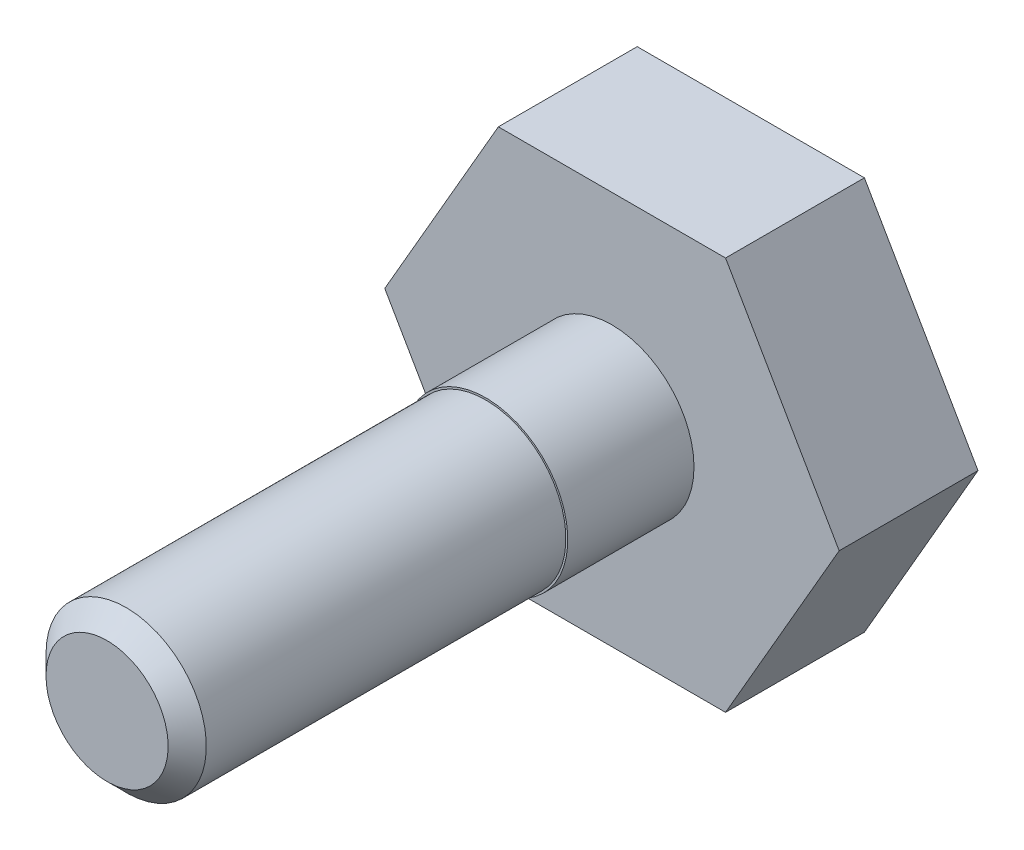
ISO-10303-21;
HEADER;
FILE_DESCRIPTION(('STEP AP214'),'2;1');
FILE_NAME('part.step','',(''),(''),'','','');
FILE_SCHEMA(('AUTOMOTIVE_DESIGN { 1 0 10303 214 1 1 1 1 }'));
ENDSEC;
DATA;
#1=APPLICATION_CONTEXT('core data for automotive mechanical design processes');
#2=APPLICATION_PROTOCOL_DEFINITION('international standard','automotive_design',2000,#1);
#3=PRODUCT_CONTEXT('',#1,'mechanical');
#4=PRODUCT('Part','Part','',(#3));
#5=PRODUCT_RELATED_PRODUCT_CATEGORY('part','',(#4));
#6=PRODUCT_DEFINITION_FORMATION('','',#4);
#7=PRODUCT_DEFINITION_CONTEXT('part definition',#1,'design');
#8=PRODUCT_DEFINITION('design','',#6,#7);
#9=PRODUCT_DEFINITION_SHAPE('','',#8);
#10=(LENGTH_UNIT() NAMED_UNIT(*) SI_UNIT(.MILLI.,.METRE.));
#11=(NAMED_UNIT(*) PLANE_ANGLE_UNIT() SI_UNIT($,.RADIAN.));
#12=(NAMED_UNIT(*) SI_UNIT($,.STERADIAN.) SOLID_ANGLE_UNIT());
#13=UNCERTAINTY_MEASURE_WITH_UNIT(LENGTH_MEASURE(1.E-05),#10,'distance_accuracy_value','');
#14=(GEOMETRIC_REPRESENTATION_CONTEXT(3) GLOBAL_UNCERTAINTY_ASSIGNED_CONTEXT((#13)) GLOBAL_UNIT_ASSIGNED_CONTEXT((#10,
#11,#12)) REPRESENTATION_CONTEXT('',''));
#15=CARTESIAN_POINT('',(0.,0.,0.));
#16=DIRECTION('',(0.,0.,1.));
#17=DIRECTION('',(1.,0.,0.));
#18=AXIS2_PLACEMENT_3D('',#15,#16,#17);
#19=CARTESIAN_POINT('',(-4.50000000000009,7.79422863405989,2.75));
#20=DIRECTION('',(0.866025403784441,-0.499999999999995,0.));
#21=DIRECTION('',(0.499999999999995,0.866025403784441,0.));
#22=AXIS2_PLACEMENT_3D('',#19,#20,#21);
#23=PLANE('',#22);
#24=DIRECTION('',(-0.499999999999995,-0.866025403784441,0.));
#25=VECTOR('',#24,1.);
#26=CARTESIAN_POINT('',(-4.50000000000009,7.79422863405989,-2.75));
#27=LINE('',#26,#25);
#28=CARTESIAN_POINT('',(-4.50000000000009,7.79422863405989,-2.75));
#29=VERTEX_POINT('',#28);
#30=CARTESIAN_POINT('',(-9.,0.,-2.75));
#31=VERTEX_POINT('',#30);
#32=EDGE_CURVE('E143',#29,#31,#27,.T.);
#33=ORIENTED_EDGE('',*,*,#32,.T.);
#34=DIRECTION('',(0.,0.,-1.));
#35=VECTOR('',#34,1.);
#36=CARTESIAN_POINT('',(-9.,0.,2.75));
#37=LINE('',#36,#35);
#38=CARTESIAN_POINT('',(-9.,0.,2.75));
#39=VERTEX_POINT('',#38);
#40=EDGE_CURVE('E60',#39,#31,#37,.T.);
#41=ORIENTED_EDGE('',*,*,#40,.F.);
#42=DIRECTION('',(-0.499999999999995,-0.866025403784441,0.));
#43=VECTOR('',#42,1.);
#44=CARTESIAN_POINT('',(-4.50000000000009,7.79422863405989,2.75));
#45=LINE('',#44,#43);
#46=CARTESIAN_POINT('',(-4.50000000000009,7.79422863405989,2.75));
#47=VERTEX_POINT('',#46);
#48=EDGE_CURVE('E154',#47,#39,#45,.T.);
#49=ORIENTED_EDGE('',*,*,#48,.F.);
#50=DIRECTION('',(0.,0.,-1.));
#51=VECTOR('',#50,1.);
#52=CARTESIAN_POINT('',(-4.50000000000009,7.79422863405989,2.75));
#53=LINE('',#52,#51);
#54=EDGE_CURVE('E139',#47,#29,#53,.T.);
#55=ORIENTED_EDGE('',*,*,#54,.T.);
#56=EDGE_LOOP('',(#33,#41,#49,#55));
#57=FACE_BOUND('',#56,.T.);
#58=ADVANCED_FACE('F57',(#57),#23,.F.);
#59=CARTESIAN_POINT('',(-9.,0.,2.75));
#60=DIRECTION('',(0.866025403784438,0.500000000000001,0.));
#61=DIRECTION('',(-0.500000000000001,0.866025403784438,0.));
#62=AXIS2_PLACEMENT_3D('',#59,#60,#61);
#63=PLANE('',#62);
#64=DIRECTION('',(0.500000000000001,-0.866025403784438,0.));
#65=VECTOR('',#64,1.);
#66=CARTESIAN_POINT('',(-9.,0.,-2.75));
#67=LINE('',#66,#65);
#68=CARTESIAN_POINT('',(-4.49999999999998,-7.79422863405996,-2.75));
#69=VERTEX_POINT('',#68);
#70=EDGE_CURVE('E146',#31,#69,#67,.T.);
#71=ORIENTED_EDGE('',*,*,#70,.T.);
#72=DIRECTION('',(0.,0.,-1.));
#73=VECTOR('',#72,1.);
#74=CARTESIAN_POINT('',(-4.49999999999998,-7.79422863405996,2.75));
#75=LINE('',#74,#73);
#76=CARTESIAN_POINT('',(-4.49999999999998,-7.79422863405996,2.75));
#77=VERTEX_POINT('',#76);
#78=EDGE_CURVE('E157',#77,#69,#75,.T.);
#79=ORIENTED_EDGE('',*,*,#78,.F.);
#80=DIRECTION('',(0.500000000000001,-0.866025403784438,0.));
#81=VECTOR('',#80,1.);
#82=CARTESIAN_POINT('',(-9.,0.,2.75));
#83=LINE('',#82,#81);
#84=EDGE_CURVE('E112',#39,#77,#83,.T.);
#85=ORIENTED_EDGE('',*,*,#84,.F.);
#86=ORIENTED_EDGE('',*,*,#40,.T.);
#87=EDGE_LOOP('',(#71,#79,#85,#86));
#88=FACE_BOUND('',#87,.T.);
#89=ADVANCED_FACE('F162',(#88),#63,.F.);
#90=CARTESIAN_POINT('',(-4.49999999999998,-7.79422863405996,2.75));
#91=DIRECTION('',(0.,1.,0.));
#92=DIRECTION('',(-1.,0.,0.));
#93=AXIS2_PLACEMENT_3D('',#90,#91,#92);
#94=PLANE('',#93);
#95=DIRECTION('',(1.,0.,0.));
#96=VECTOR('',#95,1.);
#97=CARTESIAN_POINT('',(-4.49999999999998,-7.79422863405996,-2.75));
#98=LINE('',#97,#96);
#99=CARTESIAN_POINT('',(4.50000000000004,-7.79422863405993,-2.75));
#100=VERTEX_POINT('',#99);
#101=EDGE_CURVE('E149',#69,#100,#98,.T.);
#102=ORIENTED_EDGE('',*,*,#101,.T.);
#103=DIRECTION('',(0.,0.,-1.));
#104=VECTOR('',#103,1.);
#105=CARTESIAN_POINT('',(4.50000000000004,-7.79422863405993,2.75));
#106=LINE('',#105,#104);
#107=CARTESIAN_POINT('',(4.50000000000004,-7.79422863405993,2.75));
#108=VERTEX_POINT('',#107);
#109=EDGE_CURVE('E134',#108,#100,#106,.T.);
#110=ORIENTED_EDGE('',*,*,#109,.F.);
#111=DIRECTION('',(1.,0.,0.));
#112=VECTOR('',#111,1.);
#113=CARTESIAN_POINT('',(-4.49999999999998,-7.79422863405996,2.75));
#114=LINE('',#113,#112);
#115=EDGE_CURVE('E125',#77,#108,#114,.T.);
#116=ORIENTED_EDGE('',*,*,#115,.F.);
#117=ORIENTED_EDGE('',*,*,#78,.T.);
#118=EDGE_LOOP('',(#102,#110,#116,#117));
#119=FACE_BOUND('',#118,.T.);
#120=ADVANCED_FACE('F168',(#119),#94,.F.);
#121=CARTESIAN_POINT('',(4.50000000000004,-7.79422863405993,2.75));
#122=DIRECTION('',(-0.866025403784442,0.499999999999995,0.));
#123=DIRECTION('',(-0.499999999999995,-0.866025403784442,0.));
#124=AXIS2_PLACEMENT_3D('',#121,#122,#123);
#125=PLANE('',#124);
#126=DIRECTION('',(0.499999999999995,0.866025403784442,0.));
#127=VECTOR('',#126,1.);
#128=CARTESIAN_POINT('',(4.50000000000004,-7.79422863405993,-2.75));
#129=LINE('',#128,#127);
#130=CARTESIAN_POINT('',(9.,0.,-2.75));
#131=VERTEX_POINT('',#130);
#132=EDGE_CURVE('E133',#100,#131,#129,.T.);
#133=ORIENTED_EDGE('',*,*,#132,.T.);
#134=DIRECTION('',(0.,0.,-1.));
#135=VECTOR('',#134,1.);
#136=CARTESIAN_POINT('',(9.,0.,2.75));
#137=LINE('',#136,#135);
#138=CARTESIAN_POINT('',(9.,0.,2.75));
#139=VERTEX_POINT('',#138);
#140=EDGE_CURVE('E130',#139,#131,#137,.T.);
#141=ORIENTED_EDGE('',*,*,#140,.F.);
#142=DIRECTION('',(0.499999999999995,0.866025403784442,0.));
#143=VECTOR('',#142,1.);
#144=CARTESIAN_POINT('',(4.50000000000004,-7.79422863405993,2.75));
#145=LINE('',#144,#143);
#146=EDGE_CURVE('E119',#108,#139,#145,.T.);
#147=ORIENTED_EDGE('',*,*,#146,.F.);
#148=ORIENTED_EDGE('',*,*,#109,.T.);
#149=EDGE_LOOP('',(#133,#141,#147,#148));
#150=FACE_BOUND('',#149,.T.);
#151=ADVANCED_FACE('F131',(#150),#125,.F.);
#152=CARTESIAN_POINT('',(9.,0.,2.75));
#153=DIRECTION('',(-0.866025403784435,-0.500000000000007,0.));
#154=DIRECTION('',(0.500000000000007,-0.866025403784435,0.));
#155=AXIS2_PLACEMENT_3D('',#152,#153,#154);
#156=PLANE('',#155);
#157=DIRECTION('',(-0.500000000000007,0.866025403784434,0.));
#158=VECTOR('',#157,1.);
#159=CARTESIAN_POINT('',(9.,0.,-2.75));
#160=LINE('',#159,#158);
#161=CARTESIAN_POINT('',(4.49999999999993,7.79422863405999,-2.75));
#162=VERTEX_POINT('',#161);
#163=EDGE_CURVE('E97',#131,#162,#160,.T.);
#164=ORIENTED_EDGE('',*,*,#163,.T.);
#165=DIRECTION('',(0.,0.,-1.));
#166=VECTOR('',#165,1.);
#167=CARTESIAN_POINT('',(4.49999999999993,7.79422863405999,2.75));
#168=LINE('',#167,#166);
#169=CARTESIAN_POINT('',(4.49999999999993,7.79422863405999,2.75));
#170=VERTEX_POINT('',#169);
#171=EDGE_CURVE('E135',#170,#162,#168,.T.);
#172=ORIENTED_EDGE('',*,*,#171,.F.);
#173=DIRECTION('',(-0.500000000000007,0.866025403784434,0.));
#174=VECTOR('',#173,1.);
#175=CARTESIAN_POINT('',(9.,0.,2.75));
#176=LINE('',#175,#174);
#177=EDGE_CURVE('E123',#139,#170,#176,.T.);
#178=ORIENTED_EDGE('',*,*,#177,.F.);
#179=ORIENTED_EDGE('',*,*,#140,.T.);
#180=EDGE_LOOP('',(#164,#172,#178,#179));
#181=FACE_BOUND('',#180,.T.);
#182=ADVANCED_FACE('F137',(#181),#156,.F.);
#183=CARTESIAN_POINT('',(4.49999999999993,7.79422863405999,2.75));
#184=DIRECTION('',(0.,-1.,0.));
#185=DIRECTION('',(1.,0.,0.));
#186=AXIS2_PLACEMENT_3D('',#183,#184,#185);
#187=PLANE('',#186);
#188=DIRECTION('',(-1.,0.,0.));
#189=VECTOR('',#188,1.);
#190=CARTESIAN_POINT('',(4.49999999999993,7.79422863405999,-2.75));
#191=LINE('',#190,#189);
#192=EDGE_CURVE('E103',#162,#29,#191,.T.);
#193=ORIENTED_EDGE('',*,*,#192,.T.);
#194=ORIENTED_EDGE('',*,*,#54,.F.);
#195=DIRECTION('',(-1.,0.,0.));
#196=VECTOR('',#195,1.);
#197=CARTESIAN_POINT('',(4.49999999999993,7.79422863405999,2.75));
#198=LINE('',#197,#196);
#199=EDGE_CURVE('E74',#170,#47,#198,.T.);
#200=ORIENTED_EDGE('',*,*,#199,.F.);
#201=ORIENTED_EDGE('',*,*,#171,.T.);
#202=EDGE_LOOP('',(#193,#194,#200,#201));
#203=FACE_BOUND('',#202,.T.);
#204=ADVANCED_FACE('F214',(#203),#187,.F.);
#205=CARTESIAN_POINT('',(0.,0.,2.75));
#206=DIRECTION('',(0.,0.,1.));
#207=DIRECTION('',(1.,0.,0.));
#208=AXIS2_PLACEMENT_3D('',#205,#206,#207);
#209=PLANE('',#208);
#210=CARTESIAN_POINT('',(0.,0.,2.75));
#211=DIRECTION('',(0.,0.,1.));
#212=DIRECTION('',(1.,0.,0.));
#213=AXIS2_PLACEMENT_3D('',#210,#211,#212);
#214=CIRCLE('',#213,3.25);
#215=CARTESIAN_POINT('',(3.25,0.,2.75));
#216=VERTEX_POINT('',#215);
#217=EDGE_CURVE('E13',#216,#216,#214,.T.);
#218=ORIENTED_EDGE('',*,*,#217,.F.);
#219=EDGE_LOOP('',(#218));
#220=FACE_BOUND('',#219,.T.);
#221=ORIENTED_EDGE('',*,*,#48,.T.);
#222=ORIENTED_EDGE('',*,*,#84,.T.);
#223=ORIENTED_EDGE('',*,*,#115,.T.);
#224=ORIENTED_EDGE('',*,*,#146,.T.);
#225=ORIENTED_EDGE('',*,*,#177,.T.);
#226=ORIENTED_EDGE('',*,*,#199,.T.);
#227=EDGE_LOOP('',(#221,#222,#223,#224,#225,#226));
#228=FACE_BOUND('',#227,.T.);
#229=ADVANCED_FACE('F121',(#220,#228),#209,.T.);
#230=CARTESIAN_POINT('',(0.,0.,-2.75));
#231=DIRECTION('',(0.,0.,1.));
#232=DIRECTION('',(1.,0.,0.));
#233=AXIS2_PLACEMENT_3D('',#230,#231,#232);
#234=PLANE('',#233);
#235=ORIENTED_EDGE('',*,*,#32,.F.);
#236=ORIENTED_EDGE('',*,*,#192,.F.);
#237=ORIENTED_EDGE('',*,*,#163,.F.);
#238=ORIENTED_EDGE('',*,*,#132,.F.);
#239=ORIENTED_EDGE('',*,*,#101,.F.);
#240=ORIENTED_EDGE('',*,*,#70,.F.);
#241=EDGE_LOOP('',(#235,#236,#237,#238,#239,#240));
#242=FACE_BOUND('',#241,.T.);
#243=ADVANCED_FACE('F167',(#242),#234,.F.);
#244=CARTESIAN_POINT('',(0.,0.,22.75));
#245=DIRECTION('',(0.,0.,-1.));
#246=DIRECTION('',(-1.,0.,0.));
#247=AXIS2_PLACEMENT_3D('',#244,#245,#246);
#248=CYLINDRICAL_SURFACE('',#247,3.25);
#249=CARTESIAN_POINT('',(0.,0.,7.75));
#250=DIRECTION('',(0.,0.,-1.));
#251=DIRECTION('',(-1.,0.,0.));
#252=AXIS2_PLACEMENT_3D('',#249,#250,#251);
#253=CIRCLE('',#252,3.25);
#254=CARTESIAN_POINT('',(-3.25,0.,7.75));
#255=VERTEX_POINT('',#254);
#256=EDGE_CURVE('E174',#255,#255,#253,.T.);
#257=ORIENTED_EDGE('',*,*,#256,.T.);
#258=EDGE_LOOP('',(#257));
#259=FACE_BOUND('',#258,.T.);
#260=ORIENTED_EDGE('',*,*,#217,.T.);
#261=EDGE_LOOP('',(#260));
#262=FACE_BOUND('',#261,.T.);
#263=ADVANCED_FACE('F219',(#259,#262),#248,.T.);
#264=CARTESIAN_POINT('',(0.,0.,22.75));
#265=DIRECTION('',(0.,0.,-1.));
#266=DIRECTION('',(-1.,0.,0.));
#267=AXIS2_PLACEMENT_3D('',#264,#265,#266);
#268=CYLINDRICAL_SURFACE('',#267,3.175);
#269=CARTESIAN_POINT('',(0.,0.,7.75));
#270=DIRECTION('',(0.,0.,-1.));
#271=DIRECTION('',(-1.,0.,0.));
#272=AXIS2_PLACEMENT_3D('',#269,#270,#271);
#273=CIRCLE('',#272,3.175);
#274=CARTESIAN_POINT('',(-3.175,0.,7.75));
#275=VERTEX_POINT('',#274);
#276=EDGE_CURVE('E147',#275,#275,#273,.T.);
#277=ORIENTED_EDGE('',*,*,#276,.F.);
#278=EDGE_LOOP('',(#277));
#279=FACE_BOUND('',#278,.T.);
#280=CARTESIAN_POINT('',(0.,0.,21.99435));
#281=DIRECTION('',(0.,0.,-1.));
#282=DIRECTION('',(-1.,0.,0.));
#283=AXIS2_PLACEMENT_3D('',#280,#281,#282);
#284=CIRCLE('',#283,3.17499999999999);
#285=CARTESIAN_POINT('',(-3.17499999999999,0.,21.99435));
#286=VERTEX_POINT('',#285);
#287=EDGE_CURVE('E180',#286,#286,#284,.T.);
#288=ORIENTED_EDGE('',*,*,#287,.T.);
#289=EDGE_LOOP('',(#288));
#290=FACE_BOUND('',#289,.T.);
#291=ADVANCED_FACE('F184',(#279,#290),#268,.T.);
#292=CARTESIAN_POINT('',(3.175,0.,7.75));
#293=DIRECTION('',(0.,0.,-1.));
#294=DIRECTION('',(-1.,0.,0.));
#295=AXIS2_PLACEMENT_3D('',#292,#293,#294);
#296=PLANE('',#295);
#297=ORIENTED_EDGE('',*,*,#256,.F.);
#298=EDGE_LOOP('',(#297));
#299=FACE_BOUND('',#298,.T.);
#300=ORIENTED_EDGE('',*,*,#276,.T.);
#301=EDGE_LOOP('',(#300));
#302=FACE_BOUND('',#301,.T.);
#303=ADVANCED_FACE('F190',(#299,#302),#296,.F.);
#304=CARTESIAN_POINT('',(0.,0.,22.75));
#305=DIRECTION('',(0.,0.,-1.));
#306=DIRECTION('',(-1.,0.,0.));
#307=AXIS2_PLACEMENT_3D('',#304,#305,#306);
#308=CONICAL_SURFACE('',#307,2.41935,0.785398163397456);
#309=ORIENTED_EDGE('',*,*,#287,.F.);
#310=EDGE_LOOP('',(#309));
#311=FACE_BOUND('',#310,.T.);
#312=CARTESIAN_POINT('',(0.,0.,22.75));
#313=DIRECTION('',(0.,0.,-1.));
#314=DIRECTION('',(-1.,0.,0.));
#315=AXIS2_PLACEMENT_3D('',#312,#313,#314);
#316=CIRCLE('',#315,2.41935);
#317=CARTESIAN_POINT('',(-2.41935,0.,22.75));
#318=VERTEX_POINT('',#317);
#319=EDGE_CURVE('E177',#318,#318,#316,.T.);
#320=ORIENTED_EDGE('',*,*,#319,.T.);
#321=EDGE_LOOP('',(#320));
#322=FACE_BOUND('',#321,.T.);
#323=ADVANCED_FACE('F186',(#311,#322),#308,.T.);
#324=CARTESIAN_POINT('',(0.,0.,22.75));
#325=DIRECTION('',(0.,0.,1.));
#326=DIRECTION('',(1.,0.,0.));
#327=AXIS2_PLACEMENT_3D('',#324,#325,#326);
#328=PLANE('',#327);
#329=ORIENTED_EDGE('',*,*,#319,.F.);
#330=EDGE_LOOP('',(#329));
#331=FACE_BOUND('',#330,.T.);
#332=ADVANCED_FACE('F189',(#331),#328,.T.);
#333=CLOSED_SHELL('',(#58,#89,#120,#151,#182,#204,#229,#243,#263,#291,#303,#323,#332));
#334=MANIFOLD_SOLID_BREP('B2',#333);
#335=ADVANCED_BREP_SHAPE_REPRESENTATION('',(#18,#334),#14);
#336=SHAPE_DEFINITION_REPRESENTATION(#9,#335);
ENDSEC;
END-ISO-10303-21;
